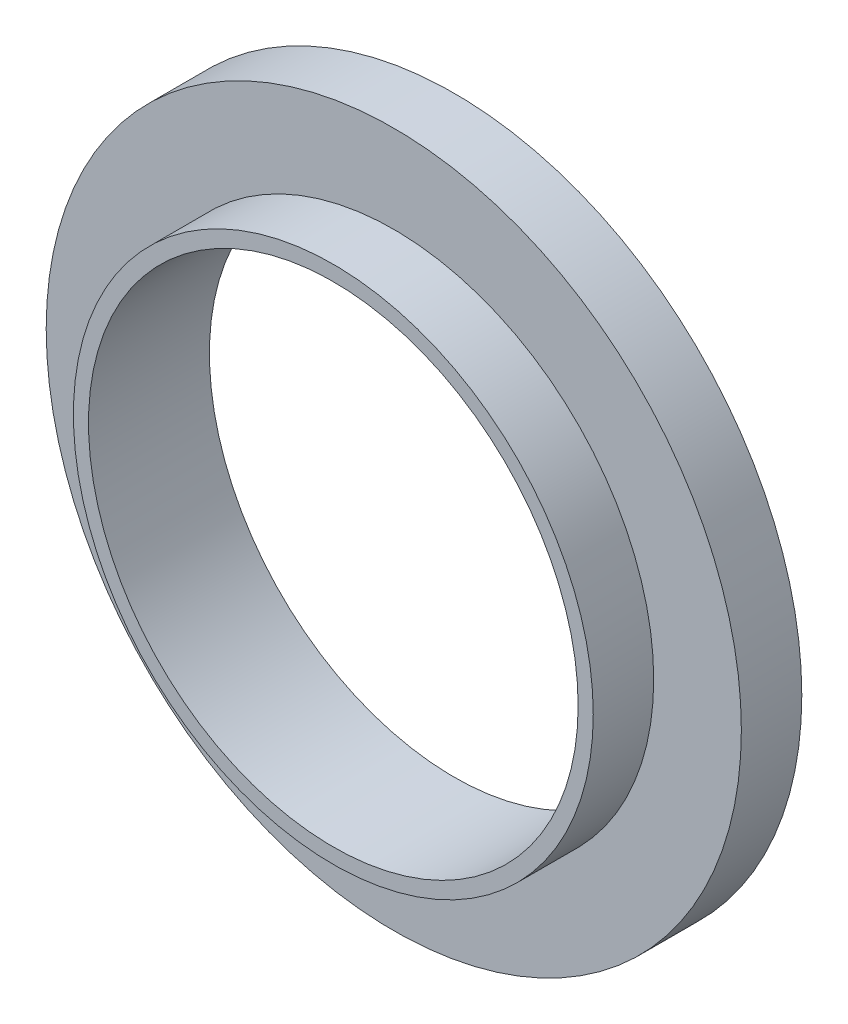
ISO-10303-21;
HEADER;
FILE_DESCRIPTION(('STEP AP214'),'2;1');
FILE_NAME('part.step','',(''),(''),'','','');
FILE_SCHEMA(('AUTOMOTIVE_DESIGN { 1 0 10303 214 1 1 1 1 }'));
ENDSEC;
DATA;
#1=APPLICATION_CONTEXT('core data for automotive mechanical design processes');
#2=APPLICATION_PROTOCOL_DEFINITION('international standard','automotive_design',2000,#1);
#3=PRODUCT_CONTEXT('',#1,'mechanical');
#4=PRODUCT('Part','Part','',(#3));
#5=PRODUCT_RELATED_PRODUCT_CATEGORY('part','',(#4));
#6=PRODUCT_DEFINITION_FORMATION('','',#4);
#7=PRODUCT_DEFINITION_CONTEXT('part definition',#1,'design');
#8=PRODUCT_DEFINITION('design','',#6,#7);
#9=PRODUCT_DEFINITION_SHAPE('','',#8);
#10=(LENGTH_UNIT() NAMED_UNIT(*) SI_UNIT(.MILLI.,.METRE.));
#11=(NAMED_UNIT(*) PLANE_ANGLE_UNIT() SI_UNIT($,.RADIAN.));
#12=(NAMED_UNIT(*) SI_UNIT($,.STERADIAN.) SOLID_ANGLE_UNIT());
#13=UNCERTAINTY_MEASURE_WITH_UNIT(LENGTH_MEASURE(1.E-05),#10,'distance_accuracy_value','');
#14=(GEOMETRIC_REPRESENTATION_CONTEXT(3) GLOBAL_UNCERTAINTY_ASSIGNED_CONTEXT((#13)) GLOBAL_UNIT_ASSIGNED_CONTEXT((#10,
#11,#12)) REPRESENTATION_CONTEXT('',''));
#15=CARTESIAN_POINT('',(0.,0.,0.));
#16=DIRECTION('',(0.,0.,1.));
#17=DIRECTION('',(1.,0.,0.));
#18=AXIS2_PLACEMENT_3D('',#15,#16,#17);
#19=CARTESIAN_POINT('',(0.,0.,10.));
#20=DIRECTION('',(0.,0.,-1.));
#21=DIRECTION('',(-1.,0.,0.));
#22=AXIS2_PLACEMENT_3D('',#19,#20,#21);
#23=CYLINDRICAL_SURFACE('',#22,57.5);
#24=CARTESIAN_POINT('',(0.,0.,10.));
#25=DIRECTION('',(0.,0.,1.));
#26=DIRECTION('',(1.,0.,0.));
#27=AXIS2_PLACEMENT_3D('',#24,#25,#26);
#28=CIRCLE('',#27,57.5);
#29=CARTESIAN_POINT('',(57.5,0.,10.));
#30=VERTEX_POINT('',#29);
#31=EDGE_CURVE('E10',#30,#30,#28,.T.);
#32=ORIENTED_EDGE('',*,*,#31,.F.);
#33=EDGE_LOOP('',(#32));
#34=FACE_BOUND('',#33,.T.);
#35=CARTESIAN_POINT('',(0.,0.,0.));
#36=DIRECTION('',(0.,0.,1.));
#37=DIRECTION('',(1.,0.,0.));
#38=AXIS2_PLACEMENT_3D('',#35,#36,#37);
#39=CIRCLE('',#38,57.5);
#40=CARTESIAN_POINT('',(57.5,0.,0.));
#41=VERTEX_POINT('',#40);
#42=EDGE_CURVE('E34',#41,#41,#39,.T.);
#43=ORIENTED_EDGE('',*,*,#42,.T.);
#44=EDGE_LOOP('',(#43));
#45=FACE_BOUND('',#44,.T.);
#46=ADVANCED_FACE('F31',(#34,#45),#23,.T.);
#47=CARTESIAN_POINT('',(0.,0.,10.));
#48=DIRECTION('',(0.,0.,1.));
#49=DIRECTION('',(1.,0.,0.));
#50=AXIS2_PLACEMENT_3D('',#47,#48,#49);
#51=PLANE('',#50);
#52=CARTESIAN_POINT('',(0.,0.,10.));
#53=DIRECTION('',(0.,0.,1.));
#54=DIRECTION('',(1.,0.,0.));
#55=AXIS2_PLACEMENT_3D('',#52,#53,#54);
#56=CIRCLE('',#55,43.);
#57=CARTESIAN_POINT('',(43.,0.,10.));
#58=VERTEX_POINT('',#57);
#59=EDGE_CURVE('E38',#58,#58,#56,.T.);
#60=ORIENTED_EDGE('',*,*,#59,.F.);
#61=EDGE_LOOP('',(#60));
#62=FACE_BOUND('',#61,.T.);
#63=ORIENTED_EDGE('',*,*,#31,.T.);
#64=EDGE_LOOP('',(#63));
#65=FACE_BOUND('',#64,.T.);
#66=ADVANCED_FACE('F73',(#62,#65),#51,.T.);
#67=CARTESIAN_POINT('',(0.,0.,0.));
#68=DIRECTION('',(0.,0.,1.));
#69=DIRECTION('',(1.,0.,0.));
#70=AXIS2_PLACEMENT_3D('',#67,#68,#69);
#71=PLANE('',#70);
#72=ORIENTED_EDGE('',*,*,#42,.F.);
#73=EDGE_LOOP('',(#72));
#74=FACE_BOUND('',#73,.T.);
#75=CARTESIAN_POINT('',(0.,0.,0.));
#76=DIRECTION('',(0.,0.,1.));
#77=DIRECTION('',(1.,0.,0.));
#78=AXIS2_PLACEMENT_3D('',#75,#76,#77);
#79=CIRCLE('',#78,40.5);
#80=CARTESIAN_POINT('',(40.5,0.,0.));
#81=VERTEX_POINT('',#80);
#82=EDGE_CURVE('E44',#81,#81,#79,.T.);
#83=ORIENTED_EDGE('',*,*,#82,.T.);
#84=EDGE_LOOP('',(#83));
#85=FACE_BOUND('',#84,.T.);
#86=ADVANCED_FACE('F70',(#74,#85),#71,.F.);
#87=CARTESIAN_POINT('',(0.,0.,20.));
#88=DIRECTION('',(0.,0.,-1.));
#89=DIRECTION('',(-1.,0.,0.));
#90=AXIS2_PLACEMENT_3D('',#87,#88,#89);
#91=CYLINDRICAL_SURFACE('',#90,40.5);
#92=CARTESIAN_POINT('',(0.,0.,20.));
#93=DIRECTION('',(0.,0.,1.));
#94=DIRECTION('',(1.,0.,0.));
#95=AXIS2_PLACEMENT_3D('',#92,#93,#94);
#96=CIRCLE('',#95,40.5);
#97=CARTESIAN_POINT('',(40.5,0.,20.));
#98=VERTEX_POINT('',#97);
#99=EDGE_CURVE('E47',#98,#98,#96,.T.);
#100=ORIENTED_EDGE('',*,*,#99,.T.);
#101=EDGE_LOOP('',(#100));
#102=FACE_BOUND('',#101,.T.);
#103=ORIENTED_EDGE('',*,*,#82,.F.);
#104=EDGE_LOOP('',(#103));
#105=FACE_BOUND('',#104,.T.);
#106=ADVANCED_FACE('F54',(#102,#105),#91,.F.);
#107=CARTESIAN_POINT('',(0.,0.,20.));
#108=DIRECTION('',(0.,0.,-1.));
#109=DIRECTION('',(-1.,0.,0.));
#110=AXIS2_PLACEMENT_3D('',#107,#108,#109);
#111=CYLINDRICAL_SURFACE('',#110,43.);
#112=ORIENTED_EDGE('',*,*,#59,.T.);
#113=EDGE_LOOP('',(#112));
#114=FACE_BOUND('',#113,.T.);
#115=CARTESIAN_POINT('',(0.,0.,20.));
#116=DIRECTION('',(0.,0.,1.));
#117=DIRECTION('',(1.,0.,0.));
#118=AXIS2_PLACEMENT_3D('',#115,#116,#117);
#119=CIRCLE('',#118,43.);
#120=CARTESIAN_POINT('',(43.,0.,20.));
#121=VERTEX_POINT('',#120);
#122=EDGE_CURVE('E48',#121,#121,#119,.T.);
#123=ORIENTED_EDGE('',*,*,#122,.F.);
#124=EDGE_LOOP('',(#123));
#125=FACE_BOUND('',#124,.T.);
#126=ADVANCED_FACE('F60',(#114,#125),#111,.T.);
#127=CARTESIAN_POINT('',(0.,0.,20.));
#128=DIRECTION('',(0.,0.,1.));
#129=DIRECTION('',(1.,0.,0.));
#130=AXIS2_PLACEMENT_3D('',#127,#128,#129);
#131=PLANE('',#130);
#132=ORIENTED_EDGE('',*,*,#99,.F.);
#133=EDGE_LOOP('',(#132));
#134=FACE_BOUND('',#133,.T.);
#135=ORIENTED_EDGE('',*,*,#122,.T.);
#136=EDGE_LOOP('',(#135));
#137=FACE_BOUND('',#136,.T.);
#138=ADVANCED_FACE('F57',(#134,#137),#131,.T.);
#139=CLOSED_SHELL('',(#46,#66,#86,#106,#126,#138));
#140=MANIFOLD_SOLID_BREP('B2',#139);
#141=ADVANCED_BREP_SHAPE_REPRESENTATION('',(#18,#140),#14);
#142=SHAPE_DEFINITION_REPRESENTATION(#9,#141);
ENDSEC;
END-ISO-10303-21;
